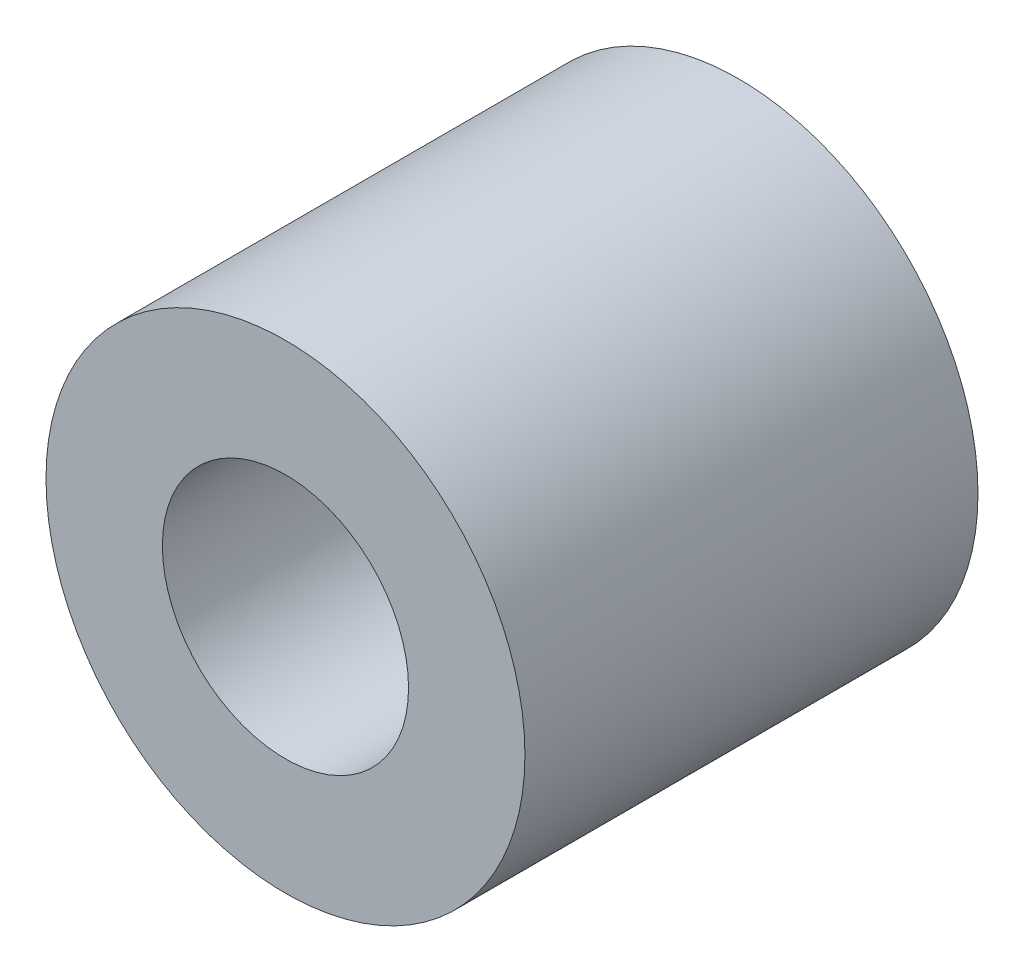
ISO-10303-21;
HEADER;
FILE_DESCRIPTION(('STEP AP214'),'2;1');
FILE_NAME('part.step','',(''),(''),'','','');
FILE_SCHEMA(('AUTOMOTIVE_DESIGN { 1 0 10303 214 1 1 1 1 }'));
ENDSEC;
DATA;
#1=APPLICATION_CONTEXT('core data for automotive mechanical design processes');
#2=APPLICATION_PROTOCOL_DEFINITION('international standard','automotive_design',2000,#1);
#3=PRODUCT_CONTEXT('',#1,'mechanical');
#4=PRODUCT('Part','Part','',(#3));
#5=PRODUCT_RELATED_PRODUCT_CATEGORY('part','',(#4));
#6=PRODUCT_DEFINITION_FORMATION('','',#4);
#7=PRODUCT_DEFINITION_CONTEXT('part definition',#1,'design');
#8=PRODUCT_DEFINITION('design','',#6,#7);
#9=PRODUCT_DEFINITION_SHAPE('','',#8);
#10=(LENGTH_UNIT() NAMED_UNIT(*) SI_UNIT(.MILLI.,.METRE.));
#11=(NAMED_UNIT(*) PLANE_ANGLE_UNIT() SI_UNIT($,.RADIAN.));
#12=(NAMED_UNIT(*) SI_UNIT($,.STERADIAN.) SOLID_ANGLE_UNIT());
#13=UNCERTAINTY_MEASURE_WITH_UNIT(LENGTH_MEASURE(1.E-05),#10,'distance_accuracy_value','');
#14=(GEOMETRIC_REPRESENTATION_CONTEXT(3) GLOBAL_UNCERTAINTY_ASSIGNED_CONTEXT((#13)) GLOBAL_UNIT_ASSIGNED_CONTEXT((#10,
#11,#12)) REPRESENTATION_CONTEXT('',''));
#15=CARTESIAN_POINT('',(0.,0.,0.));
#16=DIRECTION('',(0.,0.,1.));
#17=DIRECTION('',(1.,0.,0.));
#18=AXIS2_PLACEMENT_3D('',#15,#16,#17);
#19=CARTESIAN_POINT('',(0.,0.,12.0142));
#20=DIRECTION('',(0.,0.,1.));
#21=DIRECTION('',(1.,0.,0.));
#22=AXIS2_PLACEMENT_3D('',#19,#20,#21);
#23=PLANE('',#22);
#24=CARTESIAN_POINT('',(0.,0.,12.0142));
#25=DIRECTION('',(0.,0.,1.));
#26=DIRECTION('',(1.,0.,0.));
#27=AXIS2_PLACEMENT_3D('',#24,#25,#26);
#28=CIRCLE('',#27,6.35);
#29=CARTESIAN_POINT('',(6.35,0.,12.0142));
#30=VERTEX_POINT('',#29);
#31=EDGE_CURVE('E10',#30,#30,#28,.T.);
#32=ORIENTED_EDGE('',*,*,#31,.T.);
#33=EDGE_LOOP('',(#32));
#34=FACE_BOUND('',#33,.T.);
#35=CARTESIAN_POINT('',(0.,0.,12.0142));
#36=DIRECTION('',(0.,0.,1.));
#37=DIRECTION('',(1.,0.,0.));
#38=AXIS2_PLACEMENT_3D('',#35,#36,#37);
#39=CIRCLE('',#38,3.2639);
#40=CARTESIAN_POINT('',(3.2639,0.,12.0142));
#41=VERTEX_POINT('',#40);
#42=EDGE_CURVE('E58',#41,#41,#39,.T.);
#43=ORIENTED_EDGE('',*,*,#42,.F.);
#44=EDGE_LOOP('',(#43));
#45=FACE_BOUND('',#44,.T.);
#46=ADVANCED_FACE('F43',(#34,#45),#23,.T.);
#47=CARTESIAN_POINT('',(0.,0.,0.));
#48=DIRECTION('',(0.,0.,1.));
#49=DIRECTION('',(1.,0.,0.));
#50=AXIS2_PLACEMENT_3D('',#47,#48,#49);
#51=PLANE('',#50);
#52=CARTESIAN_POINT('',(0.,0.,0.));
#53=DIRECTION('',(0.,0.,1.));
#54=DIRECTION('',(1.,0.,0.));
#55=AXIS2_PLACEMENT_3D('',#52,#53,#54);
#56=CIRCLE('',#55,6.35);
#57=CARTESIAN_POINT('',(6.35,0.,0.));
#58=VERTEX_POINT('',#57);
#59=EDGE_CURVE('E47',#58,#58,#56,.T.);
#60=ORIENTED_EDGE('',*,*,#59,.F.);
#61=EDGE_LOOP('',(#60));
#62=FACE_BOUND('',#61,.T.);
#63=CARTESIAN_POINT('',(0.,0.,0.));
#64=DIRECTION('',(0.,0.,1.));
#65=DIRECTION('',(1.,0.,0.));
#66=AXIS2_PLACEMENT_3D('',#63,#64,#65);
#67=CIRCLE('',#66,3.2639);
#68=CARTESIAN_POINT('',(3.2639,0.,0.));
#69=VERTEX_POINT('',#68);
#70=EDGE_CURVE('E60',#69,#69,#67,.T.);
#71=ORIENTED_EDGE('',*,*,#70,.T.);
#72=EDGE_LOOP('',(#71));
#73=FACE_BOUND('',#72,.T.);
#74=ADVANCED_FACE('F74',(#62,#73),#51,.F.);
#75=CARTESIAN_POINT('',(0.,0.,12.0142));
#76=DIRECTION('',(0.,0.,-1.));
#77=DIRECTION('',(-1.,0.,0.));
#78=AXIS2_PLACEMENT_3D('',#75,#76,#77);
#79=CYLINDRICAL_SURFACE('',#78,6.35);
#80=ORIENTED_EDGE('',*,*,#31,.F.);
#81=EDGE_LOOP('',(#80));
#82=FACE_BOUND('',#81,.T.);
#83=ORIENTED_EDGE('',*,*,#59,.T.);
#84=EDGE_LOOP('',(#83));
#85=FACE_BOUND('',#84,.T.);
#86=ADVANCED_FACE('F45',(#82,#85),#79,.T.);
#87=CARTESIAN_POINT('',(0.,0.,12.0142));
#88=DIRECTION('',(0.,0.,-1.));
#89=DIRECTION('',(-1.,0.,0.));
#90=AXIS2_PLACEMENT_3D('',#87,#88,#89);
#91=CYLINDRICAL_SURFACE('',#90,3.2639);
#92=ORIENTED_EDGE('',*,*,#42,.T.);
#93=EDGE_LOOP('',(#92));
#94=FACE_BOUND('',#93,.T.);
#95=ORIENTED_EDGE('',*,*,#70,.F.);
#96=EDGE_LOOP('',(#95));
#97=FACE_BOUND('',#96,.T.);
#98=ADVANCED_FACE('F70',(#94,#97),#91,.F.);
#99=CLOSED_SHELL('',(#46,#74,#86,#98));
#100=MANIFOLD_SOLID_BREP('B2',#99);
#101=ADVANCED_BREP_SHAPE_REPRESENTATION('',(#18,#100),#14);
#102=SHAPE_DEFINITION_REPRESENTATION(#9,#101);
ENDSEC;
END-ISO-10303-21;
